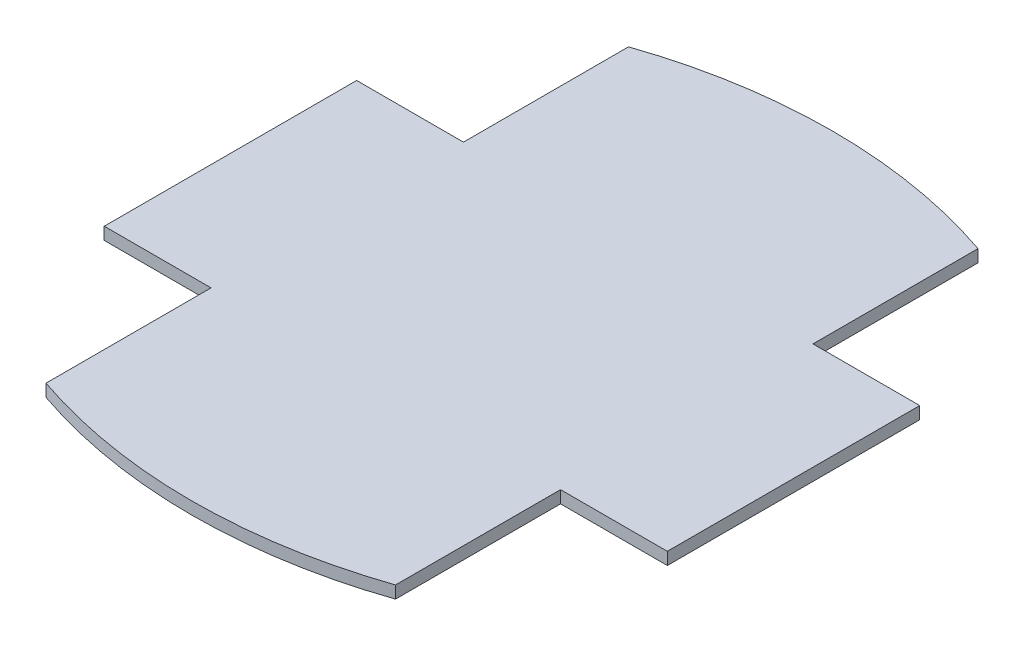
ISO-10303-21;
HEADER;
FILE_DESCRIPTION(('STEP AP214'),'2;1');
FILE_NAME('part.step','',(''),(''),'','','');
FILE_SCHEMA(('AUTOMOTIVE_DESIGN { 1 0 10303 214 1 1 1 1 }'));
ENDSEC;
DATA;
#1=APPLICATION_CONTEXT('core data for automotive mechanical design processes');
#2=APPLICATION_PROTOCOL_DEFINITION('international standard','automotive_design',2000,#1);
#3=PRODUCT_CONTEXT('',#1,'mechanical');
#4=PRODUCT('Part','Part','',(#3));
#5=PRODUCT_RELATED_PRODUCT_CATEGORY('part','',(#4));
#6=PRODUCT_DEFINITION_FORMATION('','',#4);
#7=PRODUCT_DEFINITION_CONTEXT('part definition',#1,'design');
#8=PRODUCT_DEFINITION('design','',#6,#7);
#9=PRODUCT_DEFINITION_SHAPE('','',#8);
#10=(LENGTH_UNIT() NAMED_UNIT(*) SI_UNIT(.MILLI.,.METRE.));
#11=(NAMED_UNIT(*) PLANE_ANGLE_UNIT() SI_UNIT($,.RADIAN.));
#12=(NAMED_UNIT(*) SI_UNIT($,.STERADIAN.) SOLID_ANGLE_UNIT());
#13=UNCERTAINTY_MEASURE_WITH_UNIT(LENGTH_MEASURE(1.E-05),#10,'distance_accuracy_value','');
#14=(GEOMETRIC_REPRESENTATION_CONTEXT(3) GLOBAL_UNCERTAINTY_ASSIGNED_CONTEXT((#13)) GLOBAL_UNIT_ASSIGNED_CONTEXT((#10,
#11,#12)) REPRESENTATION_CONTEXT('',''));
#15=CARTESIAN_POINT('',(0.,0.,0.));
#16=DIRECTION('',(0.,0.,1.));
#17=DIRECTION('',(1.,0.,0.));
#18=AXIS2_PLACEMENT_3D('',#15,#16,#17);
#19=CARTESIAN_POINT('',(-90.,6.35,0.));
#20=DIRECTION('',(-1.,0.,0.));
#21=DIRECTION('',(0.,0.,1.));
#22=AXIS2_PLACEMENT_3D('',#19,#20,#21);
#23=PLANE('',#22);
#24=DIRECTION('',(0.,0.,-1.));
#25=VECTOR('',#24,1.);
#26=CARTESIAN_POINT('',(-90.,0.,0.));
#27=LINE('',#26,#25);
#28=CARTESIAN_POINT('',(-90.,0.,150.));
#29=VERTEX_POINT('',#28);
#30=CARTESIAN_POINT('',(-90.,0.,65.));
#31=VERTEX_POINT('',#30);
#32=EDGE_CURVE('E154',#29,#31,#27,.T.);
#33=ORIENTED_EDGE('',*,*,#32,.F.);
#34=DIRECTION('',(0.,-1.,0.));
#35=VECTOR('',#34,1.);
#36=CARTESIAN_POINT('',(-90.,6.35,150.));
#37=LINE('',#36,#35);
#38=CARTESIAN_POINT('',(-90.,6.35,150.));
#39=VERTEX_POINT('',#38);
#40=EDGE_CURVE('E11',#39,#29,#37,.T.);
#41=ORIENTED_EDGE('',*,*,#40,.F.);
#42=DIRECTION('',(0.,0.,-1.));
#43=VECTOR('',#42,1.);
#44=CARTESIAN_POINT('',(-90.,6.35,0.));
#45=LINE('',#44,#43);
#46=CARTESIAN_POINT('',(-90.,6.35,65.));
#47=VERTEX_POINT('',#46);
#48=EDGE_CURVE('E180',#39,#47,#45,.T.);
#49=ORIENTED_EDGE('',*,*,#48,.T.);
#50=DIRECTION('',(0.,-1.,0.));
#51=VECTOR('',#50,1.);
#52=CARTESIAN_POINT('',(-90.,6.35,65.));
#53=LINE('',#52,#51);
#54=EDGE_CURVE('E52',#47,#31,#53,.T.);
#55=ORIENTED_EDGE('',*,*,#54,.T.);
#56=EDGE_LOOP('',(#33,#41,#49,#55));
#57=FACE_BOUND('',#56,.T.);
#58=ADVANCED_FACE('F35',(#57),#23,.T.);
#59=CARTESIAN_POINT('',(0.,6.35,-112.500000000001));
#60=DIRECTION('',(0.,-1.,0.));
#61=DIRECTION('',(0.,0.,-1.));
#62=AXIS2_PLACEMENT_3D('',#59,#60,#61);
#63=CYLINDRICAL_SURFACE('',#62,277.500000000001);
#64=CARTESIAN_POINT('',(0.,0.,-112.500000000001));
#65=DIRECTION('',(0.,1.,0.));
#66=DIRECTION('',(0.,0.,1.));
#67=AXIS2_PLACEMENT_3D('',#64,#65,#66);
#68=CIRCLE('',#67,277.500000000001);
#69=CARTESIAN_POINT('',(90.,0.,150.));
#70=VERTEX_POINT('',#69);
#71=EDGE_CURVE('E156',#29,#70,#68,.T.);
#72=ORIENTED_EDGE('',*,*,#71,.T.);
#73=DIRECTION('',(0.,-1.,0.));
#74=VECTOR('',#73,1.);
#75=CARTESIAN_POINT('',(90.,6.35,150.));
#76=LINE('',#75,#74);
#77=CARTESIAN_POINT('',(90.,6.35,150.));
#78=VERTEX_POINT('',#77);
#79=EDGE_CURVE('E44',#78,#70,#76,.T.);
#80=ORIENTED_EDGE('',*,*,#79,.F.);
#81=CARTESIAN_POINT('',(0.,6.35,-112.500000000001));
#82=DIRECTION('',(0.,1.,0.));
#83=DIRECTION('',(0.,0.,1.));
#84=AXIS2_PLACEMENT_3D('',#81,#82,#83);
#85=CIRCLE('',#84,277.500000000001);
#86=EDGE_CURVE('E221',#39,#78,#85,.T.);
#87=ORIENTED_EDGE('',*,*,#86,.F.);
#88=ORIENTED_EDGE('',*,*,#40,.T.);
#89=EDGE_LOOP('',(#72,#80,#87,#88));
#90=FACE_BOUND('',#89,.T.);
#91=ADVANCED_FACE('F37',(#90),#63,.T.);
#92=CARTESIAN_POINT('',(90.,6.35,0.));
#93=DIRECTION('',(-1.,0.,0.));
#94=DIRECTION('',(0.,0.,1.));
#95=AXIS2_PLACEMENT_3D('',#92,#93,#94);
#96=PLANE('',#95);
#97=DIRECTION('',(0.,0.,-1.));
#98=VECTOR('',#97,1.);
#99=CARTESIAN_POINT('',(90.,0.,0.));
#100=LINE('',#99,#98);
#101=CARTESIAN_POINT('',(90.,0.,65.));
#102=VERTEX_POINT('',#101);
#103=EDGE_CURVE('E159',#70,#102,#100,.T.);
#104=ORIENTED_EDGE('',*,*,#103,.T.);
#105=DIRECTION('',(0.,-1.,0.));
#106=VECTOR('',#105,1.);
#107=CARTESIAN_POINT('',(90.,6.35,65.));
#108=LINE('',#107,#106);
#109=CARTESIAN_POINT('',(90.,6.35,65.));
#110=VERTEX_POINT('',#109);
#111=EDGE_CURVE('E194',#110,#102,#108,.T.);
#112=ORIENTED_EDGE('',*,*,#111,.F.);
#113=DIRECTION('',(0.,0.,-1.));
#114=VECTOR('',#113,1.);
#115=CARTESIAN_POINT('',(90.,6.35,0.));
#116=LINE('',#115,#114);
#117=EDGE_CURVE('E203',#78,#110,#116,.T.);
#118=ORIENTED_EDGE('',*,*,#117,.F.);
#119=ORIENTED_EDGE('',*,*,#79,.T.);
#120=EDGE_LOOP('',(#104,#112,#118,#119));
#121=FACE_BOUND('',#120,.T.);
#122=ADVANCED_FACE('F201',(#121),#96,.F.);
#123=CARTESIAN_POINT('',(0.,6.35,65.));
#124=DIRECTION('',(0.,0.,-1.));
#125=DIRECTION('',(-1.,0.,0.));
#126=AXIS2_PLACEMENT_3D('',#123,#124,#125);
#127=PLANE('',#126);
#128=DIRECTION('',(1.,0.,0.));
#129=VECTOR('',#128,1.);
#130=CARTESIAN_POINT('',(0.,0.,65.));
#131=LINE('',#130,#129);
#132=CARTESIAN_POINT('',(145.,0.,65.));
#133=VERTEX_POINT('',#132);
#134=EDGE_CURVE('E161',#102,#133,#131,.T.);
#135=ORIENTED_EDGE('',*,*,#134,.T.);
#136=DIRECTION('',(0.,-1.,0.));
#137=VECTOR('',#136,1.);
#138=CARTESIAN_POINT('',(145.,6.35,65.));
#139=LINE('',#138,#137);
#140=CARTESIAN_POINT('',(145.,6.35,65.));
#141=VERTEX_POINT('',#140);
#142=EDGE_CURVE('E192',#141,#133,#139,.T.);
#143=ORIENTED_EDGE('',*,*,#142,.F.);
#144=DIRECTION('',(1.,0.,0.));
#145=VECTOR('',#144,1.);
#146=CARTESIAN_POINT('',(0.,6.35,65.));
#147=LINE('',#146,#145);
#148=EDGE_CURVE('E215',#110,#141,#147,.T.);
#149=ORIENTED_EDGE('',*,*,#148,.F.);
#150=ORIENTED_EDGE('',*,*,#111,.T.);
#151=EDGE_LOOP('',(#135,#143,#149,#150));
#152=FACE_BOUND('',#151,.T.);
#153=ADVANCED_FACE('F212',(#152),#127,.F.);
#154=CARTESIAN_POINT('',(145.,6.35,0.));
#155=DIRECTION('',(1.,0.,0.));
#156=DIRECTION('',(0.,0.,-1.));
#157=AXIS2_PLACEMENT_3D('',#154,#155,#156);
#158=PLANE('',#157);
#159=DIRECTION('',(0.,0.,1.));
#160=VECTOR('',#159,1.);
#161=CARTESIAN_POINT('',(145.,0.,0.));
#162=LINE('',#161,#160);
#163=CARTESIAN_POINT('',(145.,0.,-65.));
#164=VERTEX_POINT('',#163);
#165=EDGE_CURVE('E165',#164,#133,#162,.T.);
#166=ORIENTED_EDGE('',*,*,#165,.F.);
#167=DIRECTION('',(0.,-1.,0.));
#168=VECTOR('',#167,1.);
#169=CARTESIAN_POINT('',(145.,6.35,-65.));
#170=LINE('',#169,#168);
#171=CARTESIAN_POINT('',(145.,6.35,-65.));
#172=VERTEX_POINT('',#171);
#173=EDGE_CURVE('E190',#172,#164,#170,.T.);
#174=ORIENTED_EDGE('',*,*,#173,.F.);
#175=DIRECTION('',(0.,0.,1.));
#176=VECTOR('',#175,1.);
#177=CARTESIAN_POINT('',(145.,6.35,0.));
#178=LINE('',#177,#176);
#179=EDGE_CURVE('E217',#172,#141,#178,.T.);
#180=ORIENTED_EDGE('',*,*,#179,.T.);
#181=ORIENTED_EDGE('',*,*,#142,.T.);
#182=EDGE_LOOP('',(#166,#174,#180,#181));
#183=FACE_BOUND('',#182,.T.);
#184=ADVANCED_FACE('F322',(#183),#158,.T.);
#185=CARTESIAN_POINT('',(0.,6.35,-65.));
#186=DIRECTION('',(0.,0.,-1.));
#187=DIRECTION('',(-1.,0.,0.));
#188=AXIS2_PLACEMENT_3D('',#185,#186,#187);
#189=PLANE('',#188);
#190=DIRECTION('',(1.,0.,0.));
#191=VECTOR('',#190,1.);
#192=CARTESIAN_POINT('',(0.,0.,-65.));
#193=LINE('',#192,#191);
#194=CARTESIAN_POINT('',(90.,0.,-65.));
#195=VERTEX_POINT('',#194);
#196=EDGE_CURVE('E168',#195,#164,#193,.T.);
#197=ORIENTED_EDGE('',*,*,#196,.F.);
#198=DIRECTION('',(0.,-1.,0.));
#199=VECTOR('',#198,1.);
#200=CARTESIAN_POINT('',(90.,6.35,-65.));
#201=LINE('',#200,#199);
#202=CARTESIAN_POINT('',(90.,6.35,-65.));
#203=VERTEX_POINT('',#202);
#204=EDGE_CURVE('E188',#203,#195,#201,.T.);
#205=ORIENTED_EDGE('',*,*,#204,.F.);
#206=DIRECTION('',(1.,0.,0.));
#207=VECTOR('',#206,1.);
#208=CARTESIAN_POINT('',(0.,6.35,-65.));
#209=LINE('',#208,#207);
#210=EDGE_CURVE('E219',#203,#172,#209,.T.);
#211=ORIENTED_EDGE('',*,*,#210,.T.);
#212=ORIENTED_EDGE('',*,*,#173,.T.);
#213=EDGE_LOOP('',(#197,#205,#211,#212));
#214=FACE_BOUND('',#213,.T.);
#215=ADVANCED_FACE('F312',(#214),#189,.T.);
#216=CARTESIAN_POINT('',(90.,0.,-150.));
#217=VERTEX_POINT('',#216);
#218=EDGE_CURVE('E162',#195,#217,#100,.T.);
#219=ORIENTED_EDGE('',*,*,#218,.T.);
#220=DIRECTION('',(0.,-1.,0.));
#221=VECTOR('',#220,1.);
#222=CARTESIAN_POINT('',(90.,6.35,-150.));
#223=LINE('',#222,#221);
#224=CARTESIAN_POINT('',(90.,6.35,-150.));
#225=VERTEX_POINT('',#224);
#226=EDGE_CURVE('E186',#225,#217,#223,.T.);
#227=ORIENTED_EDGE('',*,*,#226,.F.);
#228=EDGE_CURVE('E223',#203,#225,#116,.T.);
#229=ORIENTED_EDGE('',*,*,#228,.F.);
#230=ORIENTED_EDGE('',*,*,#204,.T.);
#231=EDGE_LOOP('',(#219,#227,#229,#230));
#232=FACE_BOUND('',#231,.T.);
#233=ADVANCED_FACE('F236',(#232),#96,.F.);
#234=CARTESIAN_POINT('',(0.,6.35,112.5));
#235=DIRECTION('',(0.,-1.,0.));
#236=DIRECTION('',(0.,0.,-1.));
#237=AXIS2_PLACEMENT_3D('',#234,#235,#236);
#238=CYLINDRICAL_SURFACE('',#237,277.5);
#239=CARTESIAN_POINT('',(0.,0.,112.5));
#240=DIRECTION('',(0.,1.,0.));
#241=DIRECTION('',(0.,0.,1.));
#242=AXIS2_PLACEMENT_3D('',#239,#240,#241);
#243=CIRCLE('',#242,277.5);
#244=CARTESIAN_POINT('',(-90.,0.,-150.));
#245=VERTEX_POINT('',#244);
#246=EDGE_CURVE('E171',#245,#217,#243,.F.);
#247=ORIENTED_EDGE('',*,*,#246,.F.);
#248=DIRECTION('',(0.,-1.,0.));
#249=VECTOR('',#248,1.);
#250=CARTESIAN_POINT('',(-90.,6.35,-150.));
#251=LINE('',#250,#249);
#252=CARTESIAN_POINT('',(-90.,6.35,-150.));
#253=VERTEX_POINT('',#252);
#254=EDGE_CURVE('E184',#253,#245,#251,.T.);
#255=ORIENTED_EDGE('',*,*,#254,.F.);
#256=CARTESIAN_POINT('',(0.,6.35,112.5));
#257=DIRECTION('',(0.,1.,0.));
#258=DIRECTION('',(0.,0.,1.));
#259=AXIS2_PLACEMENT_3D('',#256,#257,#258);
#260=CIRCLE('',#259,277.5);
#261=EDGE_CURVE('E227',#253,#225,#260,.F.);
#262=ORIENTED_EDGE('',*,*,#261,.T.);
#263=ORIENTED_EDGE('',*,*,#226,.T.);
#264=EDGE_LOOP('',(#247,#255,#262,#263));
#265=FACE_BOUND('',#264,.T.);
#266=ADVANCED_FACE('F239',(#265),#238,.T.);
#267=CARTESIAN_POINT('',(-90.,0.,-65.));
#268=VERTEX_POINT('',#267);
#269=EDGE_CURVE('E157',#268,#245,#27,.T.);
#270=ORIENTED_EDGE('',*,*,#269,.F.);
#271=DIRECTION('',(0.,-1.,0.));
#272=VECTOR('',#271,1.);
#273=CARTESIAN_POINT('',(-90.,6.35,-65.));
#274=LINE('',#273,#272);
#275=CARTESIAN_POINT('',(-90.,6.35,-65.));
#276=VERTEX_POINT('',#275);
#277=EDGE_CURVE('E146',#276,#268,#274,.T.);
#278=ORIENTED_EDGE('',*,*,#277,.F.);
#279=EDGE_CURVE('E136',#276,#253,#45,.T.);
#280=ORIENTED_EDGE('',*,*,#279,.T.);
#281=ORIENTED_EDGE('',*,*,#254,.T.);
#282=EDGE_LOOP('',(#270,#278,#280,#281));
#283=FACE_BOUND('',#282,.T.);
#284=ADVANCED_FACE('F243',(#283),#23,.T.);
#285=CARTESIAN_POINT('',(0.,6.35,-65.));
#286=DIRECTION('',(0.,0.,1.));
#287=DIRECTION('',(1.,0.,0.));
#288=AXIS2_PLACEMENT_3D('',#285,#286,#287);
#289=PLANE('',#288);
#290=DIRECTION('',(-1.,0.,0.));
#291=VECTOR('',#290,1.);
#292=CARTESIAN_POINT('',(0.,0.,-65.));
#293=LINE('',#292,#291);
#294=CARTESIAN_POINT('',(-145.,0.,-65.));
#295=VERTEX_POINT('',#294);
#296=EDGE_CURVE('E143',#268,#295,#293,.T.);
#297=ORIENTED_EDGE('',*,*,#296,.T.);
#298=DIRECTION('',(0.,-1.,0.));
#299=VECTOR('',#298,1.);
#300=CARTESIAN_POINT('',(-145.,6.35,-65.));
#301=LINE('',#300,#299);
#302=CARTESIAN_POINT('',(-145.,6.35,-65.));
#303=VERTEX_POINT('',#302);
#304=EDGE_CURVE('E140',#303,#295,#301,.T.);
#305=ORIENTED_EDGE('',*,*,#304,.F.);
#306=DIRECTION('',(-1.,0.,0.));
#307=VECTOR('',#306,1.);
#308=CARTESIAN_POINT('',(0.,6.35,-65.));
#309=LINE('',#308,#307);
#310=EDGE_CURVE('E127',#276,#303,#309,.T.);
#311=ORIENTED_EDGE('',*,*,#310,.F.);
#312=ORIENTED_EDGE('',*,*,#277,.T.);
#313=EDGE_LOOP('',(#297,#305,#311,#312));
#314=FACE_BOUND('',#313,.T.);
#315=ADVANCED_FACE('F141',(#314),#289,.F.);
#316=CARTESIAN_POINT('',(-145.,6.35,0.));
#317=DIRECTION('',(1.,0.,0.));
#318=DIRECTION('',(0.,0.,-1.));
#319=AXIS2_PLACEMENT_3D('',#316,#317,#318);
#320=PLANE('',#319);
#321=DIRECTION('',(0.,0.,1.));
#322=VECTOR('',#321,1.);
#323=CARTESIAN_POINT('',(-145.,0.,0.));
#324=LINE('',#323,#322);
#325=CARTESIAN_POINT('',(-145.,0.,65.));
#326=VERTEX_POINT('',#325);
#327=EDGE_CURVE('E175',#295,#326,#324,.T.);
#328=ORIENTED_EDGE('',*,*,#327,.T.);
#329=DIRECTION('',(0.,-1.,0.));
#330=VECTOR('',#329,1.);
#331=CARTESIAN_POINT('',(-145.,6.35,65.));
#332=LINE('',#331,#330);
#333=CARTESIAN_POINT('',(-145.,6.35,65.));
#334=VERTEX_POINT('',#333);
#335=EDGE_CURVE('E90',#334,#326,#332,.T.);
#336=ORIENTED_EDGE('',*,*,#335,.F.);
#337=DIRECTION('',(0.,0.,1.));
#338=VECTOR('',#337,1.);
#339=CARTESIAN_POINT('',(-145.,6.35,0.));
#340=LINE('',#339,#338);
#341=EDGE_CURVE('E133',#303,#334,#340,.T.);
#342=ORIENTED_EDGE('',*,*,#341,.F.);
#343=ORIENTED_EDGE('',*,*,#304,.T.);
#344=EDGE_LOOP('',(#328,#336,#342,#343));
#345=FACE_BOUND('',#344,.T.);
#346=ADVANCED_FACE('F148',(#345),#320,.F.);
#347=CARTESIAN_POINT('',(0.,6.35,65.));
#348=DIRECTION('',(0.,0.,1.));
#349=DIRECTION('',(1.,0.,0.));
#350=AXIS2_PLACEMENT_3D('',#347,#348,#349);
#351=PLANE('',#350);
#352=DIRECTION('',(-1.,0.,0.));
#353=VECTOR('',#352,1.);
#354=CARTESIAN_POINT('',(0.,0.,65.));
#355=LINE('',#354,#353);
#356=EDGE_CURVE('E177',#31,#326,#355,.T.);
#357=ORIENTED_EDGE('',*,*,#356,.F.);
#358=ORIENTED_EDGE('',*,*,#54,.F.);
#359=DIRECTION('',(-1.,0.,0.));
#360=VECTOR('',#359,1.);
#361=CARTESIAN_POINT('',(0.,6.35,65.));
#362=LINE('',#361,#360);
#363=EDGE_CURVE('E149',#47,#334,#362,.T.);
#364=ORIENTED_EDGE('',*,*,#363,.T.);
#365=ORIENTED_EDGE('',*,*,#335,.T.);
#366=EDGE_LOOP('',(#357,#358,#364,#365));
#367=FACE_BOUND('',#366,.T.);
#368=ADVANCED_FACE('F256',(#367),#351,.T.);
#369=CARTESIAN_POINT('',(0.,6.35,0.));
#370=DIRECTION('',(0.,1.,0.));
#371=DIRECTION('',(0.,0.,1.));
#372=AXIS2_PLACEMENT_3D('',#369,#370,#371);
#373=PLANE('',#372);
#374=ORIENTED_EDGE('',*,*,#48,.F.);
#375=ORIENTED_EDGE('',*,*,#86,.T.);
#376=ORIENTED_EDGE('',*,*,#117,.T.);
#377=ORIENTED_EDGE('',*,*,#148,.T.);
#378=ORIENTED_EDGE('',*,*,#179,.F.);
#379=ORIENTED_EDGE('',*,*,#210,.F.);
#380=ORIENTED_EDGE('',*,*,#228,.T.);
#381=ORIENTED_EDGE('',*,*,#261,.F.);
#382=ORIENTED_EDGE('',*,*,#279,.F.);
#383=ORIENTED_EDGE('',*,*,#310,.T.);
#384=ORIENTED_EDGE('',*,*,#341,.T.);
#385=ORIENTED_EDGE('',*,*,#363,.F.);
#386=EDGE_LOOP('',(#374,#375,#376,#377,#378,#379,#380,#381,#382,#383,#384,#385));
#387=FACE_BOUND('',#386,.T.);
#388=ADVANCED_FACE('F130',(#387),#373,.T.);
#389=CARTESIAN_POINT('',(0.,0.,0.));
#390=DIRECTION('',(0.,1.,0.));
#391=DIRECTION('',(0.,0.,1.));
#392=AXIS2_PLACEMENT_3D('',#389,#390,#391);
#393=PLANE('',#392);
#394=ORIENTED_EDGE('',*,*,#32,.T.);
#395=ORIENTED_EDGE('',*,*,#356,.T.);
#396=ORIENTED_EDGE('',*,*,#327,.F.);
#397=ORIENTED_EDGE('',*,*,#296,.F.);
#398=ORIENTED_EDGE('',*,*,#269,.T.);
#399=ORIENTED_EDGE('',*,*,#246,.T.);
#400=ORIENTED_EDGE('',*,*,#218,.F.);
#401=ORIENTED_EDGE('',*,*,#196,.T.);
#402=ORIENTED_EDGE('',*,*,#165,.T.);
#403=ORIENTED_EDGE('',*,*,#134,.F.);
#404=ORIENTED_EDGE('',*,*,#103,.F.);
#405=ORIENTED_EDGE('',*,*,#71,.F.);
#406=EDGE_LOOP('',(#394,#395,#396,#397,#398,#399,#400,#401,#402,#403,#404,#405));
#407=FACE_BOUND('',#406,.T.);
#408=ADVANCED_FACE('F208',(#407),#393,.F.);
#409=CLOSED_SHELL('',(#58,#91,#122,#153,#184,#215,#233,#266,#284,#315,#346,#368,#388,#408));
#410=MANIFOLD_SOLID_BREP('B2',#409);
#411=ADVANCED_BREP_SHAPE_REPRESENTATION('',(#18,#410),#14);
#412=SHAPE_DEFINITION_REPRESENTATION(#9,#411);
ENDSEC;
END-ISO-10303-21;
